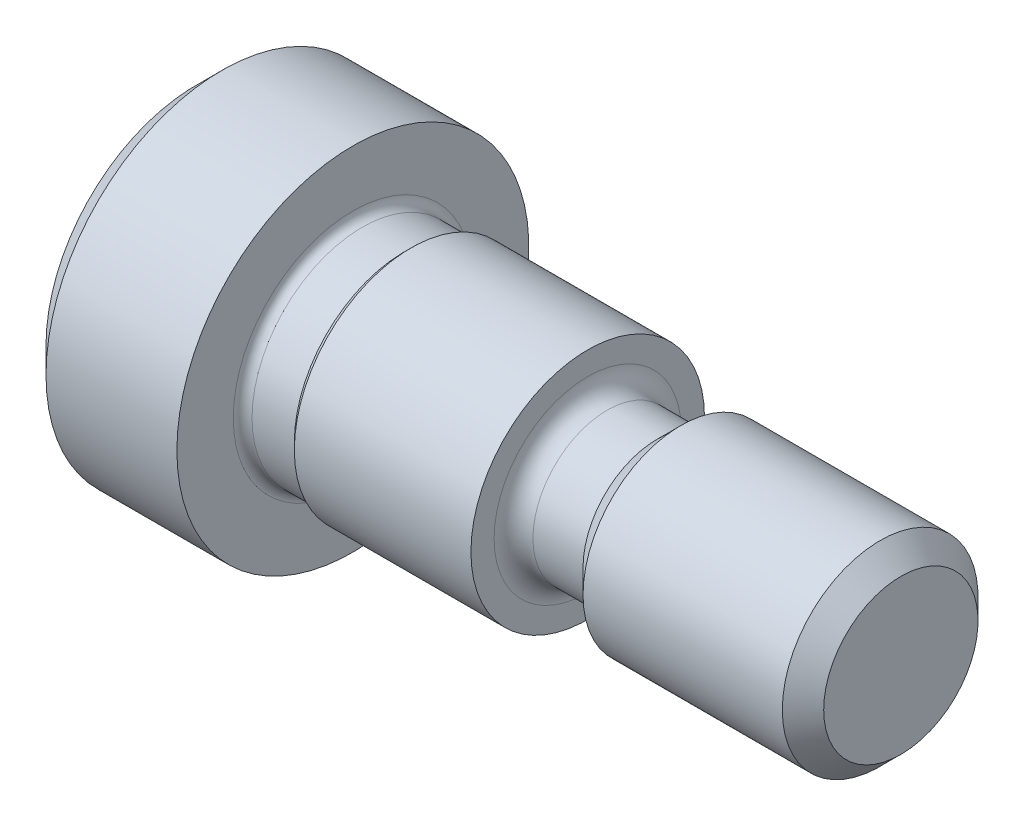
ISO-10303-21;
HEADER;
FILE_DESCRIPTION(('STEP AP214'),'2;1');
FILE_NAME('part.step','',(''),(''),'','','');
FILE_SCHEMA(('AUTOMOTIVE_DESIGN { 1 0 10303 214 1 1 1 1 }'));
ENDSEC;
DATA;
#1=APPLICATION_CONTEXT('core data for automotive mechanical design processes');
#2=APPLICATION_PROTOCOL_DEFINITION('international standard','automotive_design',2000,#1);
#3=PRODUCT_CONTEXT('',#1,'mechanical');
#4=PRODUCT('Part','Part','',(#3));
#5=PRODUCT_RELATED_PRODUCT_CATEGORY('part','',(#4));
#6=PRODUCT_DEFINITION_FORMATION('','',#4);
#7=PRODUCT_DEFINITION_CONTEXT('part definition',#1,'design');
#8=PRODUCT_DEFINITION('design','',#6,#7);
#9=PRODUCT_DEFINITION_SHAPE('','',#8);
#10=(LENGTH_UNIT() NAMED_UNIT(*) SI_UNIT(.MILLI.,.METRE.));
#11=(NAMED_UNIT(*) PLANE_ANGLE_UNIT() SI_UNIT($,.RADIAN.));
#12=(NAMED_UNIT(*) SI_UNIT($,.STERADIAN.) SOLID_ANGLE_UNIT());
#13=UNCERTAINTY_MEASURE_WITH_UNIT(LENGTH_MEASURE(1.E-05),#10,'distance_accuracy_value','');
#14=(GEOMETRIC_REPRESENTATION_CONTEXT(3) GLOBAL_UNCERTAINTY_ASSIGNED_CONTEXT((#13)) GLOBAL_UNIT_ASSIGNED_CONTEXT((#10,
#11,#12)) REPRESENTATION_CONTEXT('',''));
#15=CARTESIAN_POINT('',(0.,0.,0.));
#16=DIRECTION('',(0.,0.,1.));
#17=DIRECTION('',(1.,0.,0.));
#18=AXIS2_PLACEMENT_3D('',#15,#16,#17);
#19=CARTESIAN_POINT('',(0.,0.,0.));
#20=DIRECTION('',(-1.,0.,0.));
#21=DIRECTION('',(0.,0.,1.));
#22=AXIS2_PLACEMENT_3D('',#19,#20,#21);
#23=PLANE('',#22);
#24=CARTESIAN_POINT('',(0.,0.,0.));
#25=DIRECTION('',(-1.,0.,0.));
#26=DIRECTION('',(0.,0.,1.));
#27=AXIS2_PLACEMENT_3D('',#24,#25,#26);
#28=CIRCLE('',#27,6.096);
#29=CARTESIAN_POINT('',(0.,0.,6.096));
#30=VERTEX_POINT('',#29);
#31=EDGE_CURVE('E11',#30,#30,#28,.T.);
#32=ORIENTED_EDGE('',*,*,#31,.T.);
#33=EDGE_LOOP('',(#32));
#34=FACE_BOUND('',#33,.T.);
#35=DIRECTION('',(0.,-0.500000000000001,-0.866025403784438));
#36=VECTOR('',#35,1.);
#37=CARTESIAN_POINT('',(0.,-1.37848150271715,2.3876));
#38=LINE('',#37,#36);
#39=CARTESIAN_POINT('',(0.,-1.37848150271715,2.3876));
#40=VERTEX_POINT('',#39);
#41=CARTESIAN_POINT('',(0.,-2.75696300543431,0.));
#42=VERTEX_POINT('',#41);
#43=EDGE_CURVE('E46',#40,#42,#38,.T.);
#44=ORIENTED_EDGE('',*,*,#43,.T.);
#45=DIRECTION('',(0.,0.500000000000001,-0.866025403784438));
#46=VECTOR('',#45,1.);
#47=CARTESIAN_POINT('',(0.,-2.75696300543431,0.));
#48=LINE('',#47,#46);
#49=CARTESIAN_POINT('',(0.,-1.37848150271715,-2.3876));
#50=VERTEX_POINT('',#49);
#51=EDGE_CURVE('E475',#42,#50,#48,.T.);
#52=ORIENTED_EDGE('',*,*,#51,.T.);
#53=DIRECTION('',(0.,1.,0.));
#54=VECTOR('',#53,1.);
#55=CARTESIAN_POINT('',(0.,-1.37848150271715,-2.3876));
#56=LINE('',#55,#54);
#57=CARTESIAN_POINT('',(0.,1.37848150271714,-2.3876));
#58=VERTEX_POINT('',#57);
#59=EDGE_CURVE('E126',#50,#58,#56,.T.);
#60=ORIENTED_EDGE('',*,*,#59,.T.);
#61=DIRECTION('',(0.,0.500000000000003,0.866025403784437));
#62=VECTOR('',#61,1.);
#63=CARTESIAN_POINT('',(0.,1.37848150271714,-2.3876));
#64=LINE('',#63,#62);
#65=CARTESIAN_POINT('',(0.,2.7569630054343,0.));
#66=VERTEX_POINT('',#65);
#67=EDGE_CURVE('E478',#58,#66,#64,.T.);
#68=ORIENTED_EDGE('',*,*,#67,.T.);
#69=DIRECTION('',(0.,-0.500000000000003,0.866025403784437));
#70=VECTOR('',#69,1.);
#71=CARTESIAN_POINT('',(0.,2.7569630054343,0.));
#72=LINE('',#71,#70);
#73=CARTESIAN_POINT('',(0.,1.37848150271714,2.3876));
#74=VERTEX_POINT('',#73);
#75=EDGE_CURVE('E480',#66,#74,#72,.T.);
#76=ORIENTED_EDGE('',*,*,#75,.T.);
#77=DIRECTION('',(0.,-1.,0.));
#78=VECTOR('',#77,1.);
#79=CARTESIAN_POINT('',(0.,1.37848150271714,2.3876));
#80=LINE('',#79,#78);
#81=EDGE_CURVE('E482',#74,#40,#80,.T.);
#82=ORIENTED_EDGE('',*,*,#81,.T.);
#83=EDGE_LOOP('',(#44,#52,#60,#68,#76,#82));
#84=FACE_BOUND('',#83,.T.);
#85=ADVANCED_FACE('F32',(#34,#84),#23,.T.);
#86=CARTESIAN_POINT('',(0.,0.,0.));
#87=DIRECTION('',(1.,0.,0.));
#88=DIRECTION('',(0.,0.,-1.));
#89=AXIS2_PLACEMENT_3D('',#86,#87,#88);
#90=CONICAL_SURFACE('',#89,6.096,0.785398163397451);
#91=CARTESIAN_POINT('',(1.0414,0.,0.));
#92=DIRECTION('',(-1.,0.,0.));
#93=DIRECTION('',(0.,0.,1.));
#94=AXIS2_PLACEMENT_3D('',#91,#92,#93);
#95=CIRCLE('',#94,7.1374);
#96=CARTESIAN_POINT('',(1.0414,0.,7.1374));
#97=VERTEX_POINT('',#96);
#98=EDGE_CURVE('E39',#97,#97,#95,.T.);
#99=ORIENTED_EDGE('',*,*,#98,.T.);
#100=EDGE_LOOP('',(#99));
#101=FACE_BOUND('',#100,.T.);
#102=ORIENTED_EDGE('',*,*,#31,.F.);
#103=EDGE_LOOP('',(#102));
#104=FACE_BOUND('',#103,.T.);
#105=ADVANCED_FACE('F178',(#101,#104),#90,.T.);
#106=CARTESIAN_POINT('',(-6.34999999999999,0.,0.));
#107=DIRECTION('',(-1.,0.,0.));
#108=DIRECTION('',(0.,0.,1.));
#109=AXIS2_PLACEMENT_3D('',#106,#107,#108);
#110=CYLINDRICAL_SURFACE('',#109,7.1374);
#111=CARTESIAN_POINT('',(6.35,0.,0.));
#112=DIRECTION('',(-1.,0.,0.));
#113=DIRECTION('',(0.,0.,1.));
#114=AXIS2_PLACEMENT_3D('',#111,#112,#113);
#115=CIRCLE('',#114,7.1374);
#116=CARTESIAN_POINT('',(6.35,0.,7.1374));
#117=VERTEX_POINT('',#116);
#118=EDGE_CURVE('E173',#117,#117,#115,.T.);
#119=ORIENTED_EDGE('',*,*,#118,.T.);
#120=EDGE_LOOP('',(#119));
#121=FACE_BOUND('',#120,.T.);
#122=ORIENTED_EDGE('',*,*,#98,.F.);
#123=EDGE_LOOP('',(#122));
#124=FACE_BOUND('',#123,.T.);
#125=ADVANCED_FACE('F181',(#121,#124),#110,.T.);
#126=CARTESIAN_POINT('',(6.35,7.1374,0.));
#127=DIRECTION('',(1.,0.,0.));
#128=DIRECTION('',(0.,0.,-1.));
#129=AXIS2_PLACEMENT_3D('',#126,#127,#128);
#130=PLANE('',#129);
#131=CARTESIAN_POINT('',(6.35,0.,0.));
#132=DIRECTION('',(-1.,0.,0.));
#133=DIRECTION('',(0.,0.,1.));
#134=AXIS2_PLACEMENT_3D('',#131,#132,#133);
#135=CIRCLE('',#134,4.8514);
#136=CARTESIAN_POINT('',(6.35,0.,4.8514));
#137=VERTEX_POINT('',#136);
#138=EDGE_CURVE('E170',#137,#137,#135,.T.);
#139=ORIENTED_EDGE('',*,*,#138,.T.);
#140=EDGE_LOOP('',(#139));
#141=FACE_BOUND('',#140,.T.);
#142=ORIENTED_EDGE('',*,*,#118,.F.);
#143=EDGE_LOOP('',(#142));
#144=FACE_BOUND('',#143,.T.);
#145=ADVANCED_FACE('F183',(#141,#144),#130,.T.);
#146=CARTESIAN_POINT('',(6.731,0.,0.));
#147=DIRECTION('',(-1.,0.,0.));
#148=DIRECTION('',(0.,0.,1.));
#149=AXIS2_PLACEMENT_3D('',#146,#147,#148);
#150=TOROIDAL_SURFACE('',#149,4.8514,0.381);
#151=ORIENTED_EDGE('',*,*,#138,.F.);
#152=EDGE_LOOP('',(#151));
#153=FACE_BOUND('',#152,.T.);
#154=CARTESIAN_POINT('',(6.731,0.,0.));
#155=DIRECTION('',(-1.,0.,0.));
#156=DIRECTION('',(0.,0.,1.));
#157=AXIS2_PLACEMENT_3D('',#154,#155,#156);
#158=CIRCLE('',#157,4.4704);
#159=CARTESIAN_POINT('',(6.731,0.,4.4704));
#160=VERTEX_POINT('',#159);
#161=EDGE_CURVE('E167',#160,#160,#158,.T.);
#162=ORIENTED_EDGE('',*,*,#161,.T.);
#163=EDGE_LOOP('',(#162));
#164=FACE_BOUND('',#163,.T.);
#165=ADVANCED_FACE('F190',(#153,#164),#150,.F.);
#166=CARTESIAN_POINT('',(-6.34999999999999,0.,0.));
#167=DIRECTION('',(-1.,0.,0.));
#168=DIRECTION('',(0.,0.,1.));
#169=AXIS2_PLACEMENT_3D('',#166,#167,#168);
#170=CYLINDRICAL_SURFACE('',#169,4.4704);
#171=CARTESIAN_POINT('',(8.4455,0.,0.));
#172=DIRECTION('',(-1.,0.,0.));
#173=DIRECTION('',(0.,0.,1.));
#174=AXIS2_PLACEMENT_3D('',#171,#172,#173);
#175=CIRCLE('',#174,4.4704);
#176=CARTESIAN_POINT('',(8.4455,0.,4.4704));
#177=VERTEX_POINT('',#176);
#178=EDGE_CURVE('E164',#177,#177,#175,.T.);
#179=ORIENTED_EDGE('',*,*,#178,.T.);
#180=EDGE_LOOP('',(#179));
#181=FACE_BOUND('',#180,.T.);
#182=ORIENTED_EDGE('',*,*,#161,.F.);
#183=EDGE_LOOP('',(#182));
#184=FACE_BOUND('',#183,.T.);
#185=ADVANCED_FACE('F223',(#181,#184),#170,.T.);
#186=CARTESIAN_POINT('',(8.4455,0.,0.));
#187=DIRECTION('',(1.,0.,0.));
#188=DIRECTION('',(0.,0.,-1.));
#189=AXIS2_PLACEMENT_3D('',#186,#187,#188);
#190=CONICAL_SURFACE('',#189,4.4704,0.785398163397448);
#191=CARTESIAN_POINT('',(8.7122,0.,0.));
#192=DIRECTION('',(-1.,0.,0.));
#193=DIRECTION('',(0.,0.,1.));
#194=AXIS2_PLACEMENT_3D('',#191,#192,#193);
#195=CIRCLE('',#194,4.7371);
#196=CARTESIAN_POINT('',(8.7122,0.,4.7371));
#197=VERTEX_POINT('',#196);
#198=EDGE_CURVE('E161',#197,#197,#195,.T.);
#199=ORIENTED_EDGE('',*,*,#198,.T.);
#200=EDGE_LOOP('',(#199));
#201=FACE_BOUND('',#200,.T.);
#202=ORIENTED_EDGE('',*,*,#178,.F.);
#203=EDGE_LOOP('',(#202));
#204=FACE_BOUND('',#203,.T.);
#205=ADVANCED_FACE('F233',(#201,#204),#190,.T.);
#206=CARTESIAN_POINT('',(-6.34999999999999,0.,0.));
#207=DIRECTION('',(-1.,0.,0.));
#208=DIRECTION('',(0.,0.,1.));
#209=AXIS2_PLACEMENT_3D('',#206,#207,#208);
#210=CYLINDRICAL_SURFACE('',#209,4.7371);
#211=CARTESIAN_POINT('',(15.875,0.,0.));
#212=DIRECTION('',(-1.,0.,0.));
#213=DIRECTION('',(0.,0.,1.));
#214=AXIS2_PLACEMENT_3D('',#211,#212,#213);
#215=CIRCLE('',#214,4.7371);
#216=CARTESIAN_POINT('',(15.875,0.,4.7371));
#217=VERTEX_POINT('',#216);
#218=EDGE_CURVE('E158',#217,#217,#215,.T.);
#219=ORIENTED_EDGE('',*,*,#218,.T.);
#220=EDGE_LOOP('',(#219));
#221=FACE_BOUND('',#220,.T.);
#222=ORIENTED_EDGE('',*,*,#198,.F.);
#223=EDGE_LOOP('',(#222));
#224=FACE_BOUND('',#223,.T.);
#225=ADVANCED_FACE('F243',(#221,#224),#210,.T.);
#226=CARTESIAN_POINT('',(15.875,4.7371,0.));
#227=DIRECTION('',(1.,0.,0.));
#228=DIRECTION('',(0.,0.,-1.));
#229=AXIS2_PLACEMENT_3D('',#226,#227,#228);
#230=PLANE('',#229);
#231=CARTESIAN_POINT('',(15.875,0.,0.));
#232=DIRECTION('',(-1.,0.,0.));
#233=DIRECTION('',(0.,0.,1.));
#234=AXIS2_PLACEMENT_3D('',#231,#232,#233);
#235=CIRCLE('',#234,3.7973);
#236=CARTESIAN_POINT('',(15.875,0.,3.7973));
#237=VERTEX_POINT('',#236);
#238=EDGE_CURVE('E155',#237,#237,#235,.T.);
#239=ORIENTED_EDGE('',*,*,#238,.T.);
#240=EDGE_LOOP('',(#239));
#241=FACE_BOUND('',#240,.T.);
#242=ORIENTED_EDGE('',*,*,#218,.F.);
#243=EDGE_LOOP('',(#242));
#244=FACE_BOUND('',#243,.T.);
#245=ADVANCED_FACE('F253',(#241,#244),#230,.T.);
#246=CARTESIAN_POINT('',(16.6624,0.,0.));
#247=DIRECTION('',(-1.,0.,0.));
#248=DIRECTION('',(0.,0.,1.));
#249=AXIS2_PLACEMENT_3D('',#246,#247,#248);
#250=TOROIDAL_SURFACE('',#249,3.7973,0.7874);
#251=CARTESIAN_POINT('',(16.6624,0.,0.));
#252=DIRECTION('',(-1.,0.,0.));
#253=DIRECTION('',(0.,0.,1.));
#254=AXIS2_PLACEMENT_3D('',#251,#252,#253);
#255=CIRCLE('',#254,3.0099);
#256=CARTESIAN_POINT('',(16.6624,0.,3.0099));
#257=VERTEX_POINT('',#256);
#258=EDGE_CURVE('E152',#257,#257,#255,.T.);
#259=ORIENTED_EDGE('',*,*,#258,.T.);
#260=EDGE_LOOP('',(#259));
#261=FACE_BOUND('',#260,.T.);
#262=ORIENTED_EDGE('',*,*,#238,.F.);
#263=EDGE_LOOP('',(#262));
#264=FACE_BOUND('',#263,.T.);
#265=ADVANCED_FACE('F263',(#261,#264),#250,.F.);
#266=CARTESIAN_POINT('',(-6.34999999999999,0.,0.));
#267=DIRECTION('',(-1.,0.,0.));
#268=DIRECTION('',(0.,0.,1.));
#269=AXIS2_PLACEMENT_3D('',#266,#267,#268);
#270=CYLINDRICAL_SURFACE('',#269,3.0099);
#271=CARTESIAN_POINT('',(18.6944,0.,0.));
#272=DIRECTION('',(-1.,0.,0.));
#273=DIRECTION('',(0.,0.,1.));
#274=AXIS2_PLACEMENT_3D('',#271,#272,#273);
#275=CIRCLE('',#274,3.0099);
#276=CARTESIAN_POINT('',(18.6944,0.,3.0099));
#277=VERTEX_POINT('',#276);
#278=EDGE_CURVE('E149',#277,#277,#275,.T.);
#279=ORIENTED_EDGE('',*,*,#278,.T.);
#280=EDGE_LOOP('',(#279));
#281=FACE_BOUND('',#280,.T.);
#282=ORIENTED_EDGE('',*,*,#258,.F.);
#283=EDGE_LOOP('',(#282));
#284=FACE_BOUND('',#283,.T.);
#285=ADVANCED_FACE('F273',(#281,#284),#270,.T.);
#286=CARTESIAN_POINT('',(18.6944,0.,0.));
#287=DIRECTION('',(1.,0.,0.));
#288=DIRECTION('',(0.,0.,-1.));
#289=AXIS2_PLACEMENT_3D('',#286,#287,#288);
#290=CONICAL_SURFACE('',#289,3.0099,0.78539816339745);
#291=CARTESIAN_POINT('',(19.65325,0.,0.));
#292=DIRECTION('',(-1.,0.,0.));
#293=DIRECTION('',(0.,0.,1.));
#294=AXIS2_PLACEMENT_3D('',#291,#292,#293);
#295=CIRCLE('',#294,3.96875);
#296=CARTESIAN_POINT('',(19.65325,0.,3.96875));
#297=VERTEX_POINT('',#296);
#298=EDGE_CURVE('E146',#297,#297,#295,.T.);
#299=ORIENTED_EDGE('',*,*,#298,.T.);
#300=EDGE_LOOP('',(#299));
#301=FACE_BOUND('',#300,.T.);
#302=ORIENTED_EDGE('',*,*,#278,.F.);
#303=EDGE_LOOP('',(#302));
#304=FACE_BOUND('',#303,.T.);
#305=ADVANCED_FACE('F283',(#301,#304),#290,.T.);
#306=CARTESIAN_POINT('',(-6.34999999999999,0.,0.));
#307=DIRECTION('',(-1.,0.,0.));
#308=DIRECTION('',(0.,0.,1.));
#309=AXIS2_PLACEMENT_3D('',#306,#307,#308);
#310=CYLINDRICAL_SURFACE('',#309,3.96875);
#311=CARTESIAN_POINT('',(27.73553,0.,0.));
#312=DIRECTION('',(-1.,0.,0.));
#313=DIRECTION('',(0.,0.,1.));
#314=AXIS2_PLACEMENT_3D('',#311,#312,#313);
#315=CIRCLE('',#314,3.96875);
#316=CARTESIAN_POINT('',(27.73553,0.,3.96875));
#317=VERTEX_POINT('',#316);
#318=EDGE_CURVE('E143',#317,#317,#315,.T.);
#319=ORIENTED_EDGE('',*,*,#318,.T.);
#320=EDGE_LOOP('',(#319));
#321=FACE_BOUND('',#320,.T.);
#322=ORIENTED_EDGE('',*,*,#298,.F.);
#323=EDGE_LOOP('',(#322));
#324=FACE_BOUND('',#323,.T.);
#325=ADVANCED_FACE('F293',(#321,#324),#310,.T.);
#326=CARTESIAN_POINT('',(27.73553,0.,0.));
#327=DIRECTION('',(-1.,0.,0.));
#328=DIRECTION('',(0.,0.,1.));
#329=AXIS2_PLACEMENT_3D('',#326,#327,#328);
#330=CONICAL_SURFACE('',#329,3.96875,0.785398163397451);
#331=CARTESIAN_POINT('',(28.575,0.,0.));
#332=DIRECTION('',(-1.,0.,0.));
#333=DIRECTION('',(0.,0.,1.));
#334=AXIS2_PLACEMENT_3D('',#331,#332,#333);
#335=CIRCLE('',#334,3.12928);
#336=CARTESIAN_POINT('',(28.575,0.,3.12928));
#337=VERTEX_POINT('',#336);
#338=EDGE_CURVE('E139',#337,#337,#335,.T.);
#339=ORIENTED_EDGE('',*,*,#338,.T.);
#340=EDGE_LOOP('',(#339));
#341=FACE_BOUND('',#340,.T.);
#342=ORIENTED_EDGE('',*,*,#318,.F.);
#343=EDGE_LOOP('',(#342));
#344=FACE_BOUND('',#343,.T.);
#345=ADVANCED_FACE('F303',(#341,#344),#330,.T.);
#346=CARTESIAN_POINT('',(28.575,3.12928,0.));
#347=DIRECTION('',(1.,0.,0.));
#348=DIRECTION('',(0.,0.,-1.));
#349=AXIS2_PLACEMENT_3D('',#346,#347,#348);
#350=PLANE('',#349);
#351=ORIENTED_EDGE('',*,*,#338,.F.);
#352=EDGE_LOOP('',(#351));
#353=FACE_BOUND('',#352,.T.);
#354=ADVANCED_FACE('F312',(#353),#350,.T.);
#355=CARTESIAN_POINT('',(3.5814,-2.75696300543431,0.));
#356=DIRECTION('',(0.,0.866025403784438,0.500000000000001));
#357=DIRECTION('',(0.,-0.500000000000001,0.866025403784438));
#358=AXIS2_PLACEMENT_3D('',#355,#356,#357);
#359=PLANE('',#358);
#360=DIRECTION('',(0.,0.500000000000001,-0.866025403784438));
#361=VECTOR('',#360,1.);
#362=CARTESIAN_POINT('',(3.5814,-2.75696300543431,0.));
#363=LINE('',#362,#361);
#364=CARTESIAN_POINT('',(3.5814,-2.75696300543431,0.));
#365=VERTEX_POINT('',#364);
#366=CARTESIAN_POINT('',(3.5814,-2.06772225407572,-1.1938));
#367=VERTEX_POINT('',#366);
#368=EDGE_CURVE('E54',#365,#367,#363,.T.);
#369=ORIENTED_EDGE('',*,*,#368,.T.);
#370=CARTESIAN_POINT('',(3.5814,-1.37848150271715,-2.3876));
#371=VERTEX_POINT('',#370);
#372=EDGE_CURVE('E104',#367,#371,#363,.T.);
#373=ORIENTED_EDGE('',*,*,#372,.T.);
#374=DIRECTION('',(-1.,0.,0.));
#375=VECTOR('',#374,1.);
#376=CARTESIAN_POINT('',(3.5814,-1.37848150271715,-2.3876));
#377=LINE('',#376,#375);
#378=EDGE_CURVE('E108',#371,#50,#377,.T.);
#379=ORIENTED_EDGE('',*,*,#378,.T.);
#380=ORIENTED_EDGE('',*,*,#51,.F.);
#381=DIRECTION('',(-1.,0.,0.));
#382=VECTOR('',#381,1.);
#383=CARTESIAN_POINT('',(3.5814,-2.75696300543431,0.));
#384=LINE('',#383,#382);
#385=EDGE_CURVE('E474',#365,#42,#384,.T.);
#386=ORIENTED_EDGE('',*,*,#385,.F.);
#387=EDGE_LOOP('',(#369,#373,#379,#380,#386));
#388=FACE_BOUND('',#387,.T.);
#389=ADVANCED_FACE('F106',(#388),#359,.T.);
#390=CARTESIAN_POINT('',(3.5814,-1.37848150271715,-2.3876));
#391=DIRECTION('',(0.,0.,1.));
#392=DIRECTION('',(0.,-1.,0.));
#393=AXIS2_PLACEMENT_3D('',#390,#391,#392);
#394=PLANE('',#393);
#395=DIRECTION('',(0.,1.,0.));
#396=VECTOR('',#395,1.);
#397=CARTESIAN_POINT('',(3.5814,-1.37848150271715,-2.3876));
#398=LINE('',#397,#396);
#399=CARTESIAN_POINT('',(3.5814,0.,-2.3876));
#400=VERTEX_POINT('',#399);
#401=EDGE_CURVE('E113',#371,#400,#398,.T.);
#402=ORIENTED_EDGE('',*,*,#401,.T.);
#403=CARTESIAN_POINT('',(3.5814,1.37848150271714,-2.3876));
#404=VERTEX_POINT('',#403);
#405=EDGE_CURVE('E121',#400,#404,#398,.T.);
#406=ORIENTED_EDGE('',*,*,#405,.T.);
#407=DIRECTION('',(-1.,0.,0.));
#408=VECTOR('',#407,1.);
#409=CARTESIAN_POINT('',(3.5814,1.37848150271714,-2.3876));
#410=LINE('',#409,#408);
#411=EDGE_CURVE('E128',#404,#58,#410,.T.);
#412=ORIENTED_EDGE('',*,*,#411,.T.);
#413=ORIENTED_EDGE('',*,*,#59,.F.);
#414=ORIENTED_EDGE('',*,*,#378,.F.);
#415=EDGE_LOOP('',(#402,#406,#412,#413,#414));
#416=FACE_BOUND('',#415,.T.);
#417=ADVANCED_FACE('F124',(#416),#394,.T.);
#418=CARTESIAN_POINT('',(3.5814,1.37848150271714,-2.3876));
#419=DIRECTION('',(0.,-0.866025403784437,0.500000000000003));
#420=DIRECTION('',(0.,-0.500000000000003,-0.866025403784437));
#421=AXIS2_PLACEMENT_3D('',#418,#419,#420);
#422=PLANE('',#421);
#423=DIRECTION('',(0.,0.500000000000003,0.866025403784437));
#424=VECTOR('',#423,1.);
#425=CARTESIAN_POINT('',(3.5814,1.37848150271714,-2.3876));
#426=LINE('',#425,#424);
#427=CARTESIAN_POINT('',(3.5814,2.06772225407572,-1.1938));
#428=VERTEX_POINT('',#427);
#429=EDGE_CURVE('E498',#404,#428,#426,.T.);
#430=ORIENTED_EDGE('',*,*,#429,.T.);
#431=CARTESIAN_POINT('',(3.5814,2.7569630054343,0.));
#432=VERTEX_POINT('',#431);
#433=EDGE_CURVE('E120',#428,#432,#426,.T.);
#434=ORIENTED_EDGE('',*,*,#433,.T.);
#435=DIRECTION('',(-1.,0.,0.));
#436=VECTOR('',#435,1.);
#437=CARTESIAN_POINT('',(3.5814,2.7569630054343,0.));
#438=LINE('',#437,#436);
#439=EDGE_CURVE('E134',#432,#66,#438,.T.);
#440=ORIENTED_EDGE('',*,*,#439,.T.);
#441=ORIENTED_EDGE('',*,*,#67,.F.);
#442=ORIENTED_EDGE('',*,*,#411,.F.);
#443=EDGE_LOOP('',(#430,#434,#440,#441,#442));
#444=FACE_BOUND('',#443,.T.);
#445=ADVANCED_FACE('F336',(#444),#422,.T.);
#446=CARTESIAN_POINT('',(3.5814,2.7569630054343,0.));
#447=DIRECTION('',(0.,-0.866025403784437,-0.500000000000003));
#448=DIRECTION('',(0.,0.500000000000003,-0.866025403784437));
#449=AXIS2_PLACEMENT_3D('',#446,#447,#448);
#450=PLANE('',#449);
#451=DIRECTION('',(0.,-0.500000000000003,0.866025403784437));
#452=VECTOR('',#451,1.);
#453=CARTESIAN_POINT('',(3.5814,2.7569630054343,0.));
#454=LINE('',#453,#452);
#455=CARTESIAN_POINT('',(3.5814,2.06772225407572,1.1938));
#456=VERTEX_POINT('',#455);
#457=EDGE_CURVE('E463',#432,#456,#454,.T.);
#458=ORIENTED_EDGE('',*,*,#457,.T.);
#459=CARTESIAN_POINT('',(3.5814,1.37848150271714,2.3876));
#460=VERTEX_POINT('',#459);
#461=EDGE_CURVE('E454',#456,#460,#454,.T.);
#462=ORIENTED_EDGE('',*,*,#461,.T.);
#463=DIRECTION('',(-1.,0.,0.));
#464=VECTOR('',#463,1.);
#465=CARTESIAN_POINT('',(3.5814,1.37848150271714,2.3876));
#466=LINE('',#465,#464);
#467=EDGE_CURVE('E468',#460,#74,#466,.T.);
#468=ORIENTED_EDGE('',*,*,#467,.T.);
#469=ORIENTED_EDGE('',*,*,#75,.F.);
#470=ORIENTED_EDGE('',*,*,#439,.F.);
#471=EDGE_LOOP('',(#458,#462,#468,#469,#470));
#472=FACE_BOUND('',#471,.T.);
#473=ADVANCED_FACE('F343',(#472),#450,.T.);
#474=CARTESIAN_POINT('',(3.5814,1.37848150271714,2.3876));
#475=DIRECTION('',(0.,0.,-1.));
#476=DIRECTION('',(-1.,0.,0.));
#477=AXIS2_PLACEMENT_3D('',#474,#475,#476);
#478=PLANE('',#477);
#479=DIRECTION('',(0.,-1.,0.));
#480=VECTOR('',#479,1.);
#481=CARTESIAN_POINT('',(3.5814,1.37848150271714,2.3876));
#482=LINE('',#481,#480);
#483=CARTESIAN_POINT('',(3.5814,0.,2.3876));
#484=VERTEX_POINT('',#483);
#485=EDGE_CURVE('E453',#460,#484,#482,.T.);
#486=ORIENTED_EDGE('',*,*,#485,.T.);
#487=CARTESIAN_POINT('',(3.5814,-1.37848150271715,2.3876));
#488=VERTEX_POINT('',#487);
#489=EDGE_CURVE('E457',#484,#488,#482,.T.);
#490=ORIENTED_EDGE('',*,*,#489,.T.);
#491=DIRECTION('',(-1.,0.,0.));
#492=VECTOR('',#491,1.);
#493=CARTESIAN_POINT('',(3.5814,-1.37848150271715,2.3876));
#494=LINE('',#493,#492);
#495=EDGE_CURVE('E487',#488,#40,#494,.T.);
#496=ORIENTED_EDGE('',*,*,#495,.T.);
#497=ORIENTED_EDGE('',*,*,#81,.F.);
#498=ORIENTED_EDGE('',*,*,#467,.F.);
#499=EDGE_LOOP('',(#486,#490,#496,#497,#498));
#500=FACE_BOUND('',#499,.T.);
#501=ADVANCED_FACE('F351',(#500),#478,.T.);
#502=CARTESIAN_POINT('',(3.5814,-1.37848150271715,2.3876));
#503=DIRECTION('',(0.,0.866025403784438,-0.500000000000001));
#504=DIRECTION('',(0.,0.500000000000001,0.866025403784438));
#505=AXIS2_PLACEMENT_3D('',#502,#503,#504);
#506=PLANE('',#505);
#507=DIRECTION('',(0.,-0.500000000000001,-0.866025403784438));
#508=VECTOR('',#507,1.);
#509=CARTESIAN_POINT('',(3.5814,-1.37848150271715,2.3876));
#510=LINE('',#509,#508);
#511=CARTESIAN_POINT('',(3.5814,-2.06772225407573,1.1938));
#512=VERTEX_POINT('',#511);
#513=EDGE_CURVE('E460',#488,#512,#510,.T.);
#514=ORIENTED_EDGE('',*,*,#513,.T.);
#515=EDGE_CURVE('E469',#512,#365,#510,.T.);
#516=ORIENTED_EDGE('',*,*,#515,.T.);
#517=ORIENTED_EDGE('',*,*,#385,.T.);
#518=ORIENTED_EDGE('',*,*,#43,.F.);
#519=ORIENTED_EDGE('',*,*,#495,.F.);
#520=EDGE_LOOP('',(#514,#516,#517,#518,#519));
#521=FACE_BOUND('',#520,.T.);
#522=ADVANCED_FACE('F359',(#521),#506,.T.);
#523=CARTESIAN_POINT('',(3.5814,0.,-4.77519999999998));
#524=DIRECTION('',(1.,0.,0.));
#525=DIRECTION('',(0.,0.,-1.));
#526=AXIS2_PLACEMENT_3D('',#523,#524,#525);
#527=PLANE('',#526);
#528=CARTESIAN_POINT('',(3.5814,0.,0.));
#529=DIRECTION('',(-1.,0.,0.));
#530=DIRECTION('',(0.,0.,1.));
#531=AXIS2_PLACEMENT_3D('',#528,#529,#530);
#532=CIRCLE('',#531,2.3876);
#533=EDGE_CURVE('E499',#428,#400,#532,.T.);
#534=ORIENTED_EDGE('',*,*,#533,.F.);
#535=ORIENTED_EDGE('',*,*,#429,.F.);
#536=ORIENTED_EDGE('',*,*,#405,.F.);
#537=EDGE_LOOP('',(#534,#535,#536));
#538=FACE_BOUND('',#537,.T.);
#539=ADVANCED_FACE('F367',(#538),#527,.F.);
#540=EDGE_CURVE('E140',#456,#428,#532,.T.);
#541=ORIENTED_EDGE('',*,*,#540,.F.);
#542=ORIENTED_EDGE('',*,*,#457,.F.);
#543=ORIENTED_EDGE('',*,*,#433,.F.);
#544=EDGE_LOOP('',(#541,#542,#543));
#545=FACE_BOUND('',#544,.T.);
#546=ADVANCED_FACE('F375',(#545),#527,.F.);
#547=EDGE_CURVE('E133',#484,#456,#532,.T.);
#548=ORIENTED_EDGE('',*,*,#547,.F.);
#549=ORIENTED_EDGE('',*,*,#485,.F.);
#550=ORIENTED_EDGE('',*,*,#461,.F.);
#551=EDGE_LOOP('',(#548,#549,#550));
#552=FACE_BOUND('',#551,.T.);
#553=ADVANCED_FACE('F383',(#552),#527,.F.);
#554=EDGE_CURVE('E127',#512,#484,#532,.T.);
#555=ORIENTED_EDGE('',*,*,#554,.F.);
#556=ORIENTED_EDGE('',*,*,#513,.F.);
#557=ORIENTED_EDGE('',*,*,#489,.F.);
#558=EDGE_LOOP('',(#555,#556,#557));
#559=FACE_BOUND('',#558,.T.);
#560=ADVANCED_FACE('F390',(#559),#527,.F.);
#561=EDGE_CURVE('E131',#367,#512,#532,.T.);
#562=ORIENTED_EDGE('',*,*,#561,.F.);
#563=ORIENTED_EDGE('',*,*,#368,.F.);
#564=ORIENTED_EDGE('',*,*,#515,.F.);
#565=EDGE_LOOP('',(#562,#563,#564));
#566=FACE_BOUND('',#565,.T.);
#567=ADVANCED_FACE('F397',(#566),#527,.F.);
#568=EDGE_CURVE('E116',#400,#367,#532,.T.);
#569=ORIENTED_EDGE('',*,*,#568,.F.);
#570=ORIENTED_EDGE('',*,*,#401,.F.);
#571=ORIENTED_EDGE('',*,*,#372,.F.);
#572=EDGE_LOOP('',(#569,#570,#571));
#573=FACE_BOUND('',#572,.T.);
#574=ADVANCED_FACE('F114',(#573),#527,.F.);
#575=CARTESIAN_POINT('',(4.95988150271717,0.,0.));
#576=DIRECTION('',(-1.,0.,0.));
#577=DIRECTION('',(0.,0.,1.));
#578=AXIS2_PLACEMENT_3D('',#575,#576,#577);
#579=CONICAL_SURFACE('',#578,0.,1.04719755119659);
#580=ORIENTED_EDGE('',*,*,#547,.T.);
#581=ORIENTED_EDGE('',*,*,#540,.T.);
#582=ORIENTED_EDGE('',*,*,#533,.T.);
#583=ORIENTED_EDGE('',*,*,#568,.T.);
#584=ORIENTED_EDGE('',*,*,#561,.T.);
#585=ORIENTED_EDGE('',*,*,#554,.T.);
#586=EDGE_LOOP('',(#580,#581,#582,#583,#584,#585));
#587=FACE_BOUND('',#586,.T.);
#588=CARTESIAN_POINT('',(4.95988150271717,0.,0.));
#589=VERTEX_POINT('',#588);
#590=VERTEX_LOOP('',#589);
#591=FACE_BOUND('',#590,.T.);
#592=ADVANCED_FACE('F410',(#587,#591),#579,.F.);
#593=CLOSED_SHELL('',(#85,#105,#125,#145,#165,#185,#205,#225,#245,#265,#285,#305,#325,#345,#354,
#389,#417,#445,#473,#501,#522,#539,#546,#553,#560,#567,#574,#592));
#594=MANIFOLD_SOLID_BREP('B2',#593);
#595=ADVANCED_BREP_SHAPE_REPRESENTATION('',(#18,#594),#14);
#596=SHAPE_DEFINITION_REPRESENTATION(#9,#595);
ENDSEC;
END-ISO-10303-21;
